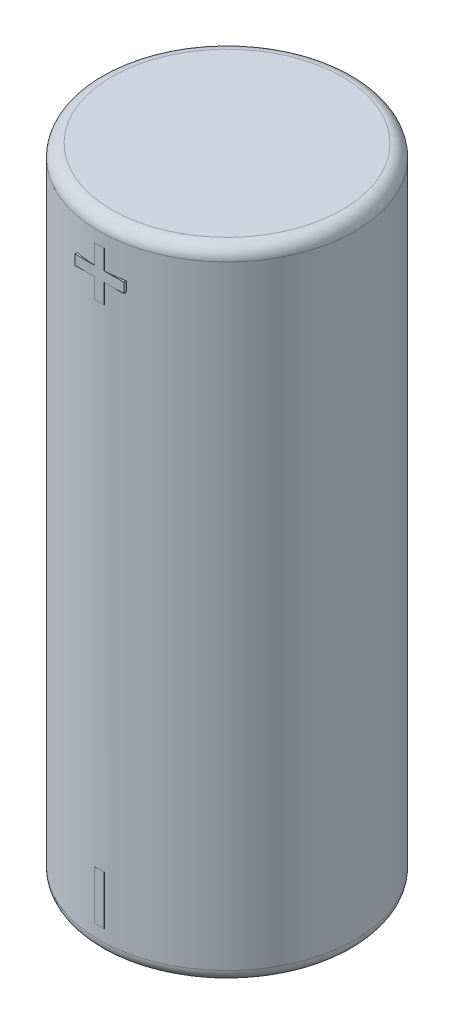
ISO-10303-21;
HEADER;
FILE_DESCRIPTION(('STEP AP214'),'2;1');
FILE_NAME('part.step','',(''),(''),'','','');
FILE_SCHEMA(('AUTOMOTIVE_DESIGN { 1 0 10303 214 1 1 1 1 }'));
ENDSEC;
DATA;
#1=APPLICATION_CONTEXT('core data for automotive mechanical design processes');
#2=APPLICATION_PROTOCOL_DEFINITION('international standard','automotive_design',2000,#1);
#3=PRODUCT_CONTEXT('',#1,'mechanical');
#4=PRODUCT('Part','Part','',(#3));
#5=PRODUCT_RELATED_PRODUCT_CATEGORY('part','',(#4));
#6=PRODUCT_DEFINITION_FORMATION('','',#4);
#7=PRODUCT_DEFINITION_CONTEXT('part definition',#1,'design');
#8=PRODUCT_DEFINITION('design','',#6,#7);
#9=PRODUCT_DEFINITION_SHAPE('','',#8);
#10=(LENGTH_UNIT() NAMED_UNIT(*) SI_UNIT(.MILLI.,.METRE.));
#11=(NAMED_UNIT(*) PLANE_ANGLE_UNIT() SI_UNIT($,.RADIAN.));
#12=(NAMED_UNIT(*) SI_UNIT($,.STERADIAN.) SOLID_ANGLE_UNIT());
#13=UNCERTAINTY_MEASURE_WITH_UNIT(LENGTH_MEASURE(1.E-05),#10,'distance_accuracy_value','');
#14=(GEOMETRIC_REPRESENTATION_CONTEXT(3) GLOBAL_UNCERTAINTY_ASSIGNED_CONTEXT((#13)) GLOBAL_UNIT_ASSIGNED_CONTEXT((#10,
#11,#12)) REPRESENTATION_CONTEXT('',''));
#15=CARTESIAN_POINT('',(0.,0.,0.));
#16=DIRECTION('',(0.,0.,1.));
#17=DIRECTION('',(1.,0.,0.));
#18=AXIS2_PLACEMENT_3D('',#15,#16,#17);
#19=CARTESIAN_POINT('',(0.,65.,0.));
#20=DIRECTION('',(0.,-1.,0.));
#21=DIRECTION('',(0.,0.,-1.));
#22=AXIS2_PLACEMENT_3D('',#19,#20,#21);
#23=CYLINDRICAL_SURFACE('',#22,13.);
#24=CARTESIAN_POINT('',(0.,7.5,0.));
#25=DIRECTION('',(0.,-1.,0.));
#26=DIRECTION('',(0.,0.,-1.));
#27=AXIS2_PLACEMENT_3D('',#24,#25,#26);
#28=CIRCLE('',#27,13.);
#29=CARTESIAN_POINT('',(0.500000000000007,7.5,12.9903810567666));
#30=VERTEX_POINT('',#29);
#31=CARTESIAN_POINT('',(0.,7.5,13.));
#32=VERTEX_POINT('',#31);
#33=EDGE_CURVE('E286',#30,#32,#28,.T.);
#34=ORIENTED_EDGE('',*,*,#33,.F.);
#35=DIRECTION('',(0.,-1.,0.));
#36=VECTOR('',#35,1.);
#37=CARTESIAN_POINT('',(0.5,65.,12.9903810567666));
#38=LINE('',#37,#36);
#39=CARTESIAN_POINT('',(0.500000000000008,2.5,12.9903810567666));
#40=VERTEX_POINT('',#39);
#41=EDGE_CURVE('E85',#40,#30,#38,.F.);
#42=ORIENTED_EDGE('',*,*,#41,.F.);
#43=CARTESIAN_POINT('',(0.,2.5,0.));
#44=DIRECTION('',(0.,-1.,0.));
#45=DIRECTION('',(0.,0.,-1.));
#46=AXIS2_PLACEMENT_3D('',#43,#44,#45);
#47=CIRCLE('',#46,13.);
#48=CARTESIAN_POINT('',(0.,2.5,13.));
#49=VERTEX_POINT('',#48);
#50=EDGE_CURVE('E290',#40,#49,#47,.T.);
#51=ORIENTED_EDGE('',*,*,#50,.T.);
#52=CARTESIAN_POINT('',(-0.500000000000002,2.5,12.9903810567666));
#53=VERTEX_POINT('',#52);
#54=EDGE_CURVE('E288',#49,#53,#47,.T.);
#55=ORIENTED_EDGE('',*,*,#54,.T.);
#56=DIRECTION('',(0.,-1.,0.));
#57=VECTOR('',#56,1.);
#58=CARTESIAN_POINT('',(-0.500000000000002,65.,12.9903810567666));
#59=LINE('',#58,#57);
#60=CARTESIAN_POINT('',(-0.499999999999993,7.5,12.9903810567666));
#61=VERTEX_POINT('',#60);
#62=EDGE_CURVE('E285',#53,#61,#59,.F.);
#63=ORIENTED_EDGE('',*,*,#62,.T.);
#64=EDGE_CURVE('E282',#32,#61,#28,.T.);
#65=ORIENTED_EDGE('',*,*,#64,.F.);
#66=EDGE_LOOP('',(#34,#42,#51,#55,#63,#65));
#67=FACE_BOUND('',#66,.T.);
#68=CARTESIAN_POINT('',(0.,1.26999999999999,0.));
#69=DIRECTION('',(0.,1.,0.));
#70=DIRECTION('',(0.,0.,1.));
#71=AXIS2_PLACEMENT_3D('',#68,#69,#70);
#72=CIRCLE('',#71,13.);
#73=CARTESIAN_POINT('',(0.,1.26999999999999,13.));
#74=VERTEX_POINT('',#73);
#75=EDGE_CURVE('E276',#74,#74,#72,.T.);
#76=ORIENTED_EDGE('',*,*,#75,.T.);
#77=EDGE_LOOP('',(#76));
#78=FACE_BOUND('',#77,.T.);
#79=CARTESIAN_POINT('',(0.,63.73,0.));
#80=DIRECTION('',(0.,1.,0.));
#81=DIRECTION('',(0.,0.,1.));
#82=AXIS2_PLACEMENT_3D('',#79,#80,#81);
#83=CIRCLE('',#82,13.);
#84=CARTESIAN_POINT('',(0.,63.73,13.));
#85=VERTEX_POINT('',#84);
#86=EDGE_CURVE('E273',#85,#85,#83,.F.);
#87=ORIENTED_EDGE('',*,*,#86,.T.);
#88=EDGE_LOOP('',(#87));
#89=FACE_BOUND('',#88,.T.);
#90=DIRECTION('',(0.,-1.,0.));
#91=VECTOR('',#90,1.);
#92=CARTESIAN_POINT('',(-0.5,65.,12.9903810567666));
#93=LINE('',#92,#91);
#94=CARTESIAN_POINT('',(-0.499999999999999,57.5,12.9903810567666));
#95=VERTEX_POINT('',#94);
#96=CARTESIAN_POINT('',(-0.499999999999999,59.5,12.9903810567666));
#97=VERTEX_POINT('',#96);
#98=EDGE_CURVE('E70',#95,#97,#93,.F.);
#99=ORIENTED_EDGE('',*,*,#98,.T.);
#100=CARTESIAN_POINT('',(0.,59.5,0.));
#101=DIRECTION('',(0.,-1.,0.));
#102=DIRECTION('',(0.,0.,-1.));
#103=AXIS2_PLACEMENT_3D('',#100,#101,#102);
#104=CIRCLE('',#103,13.);
#105=CARTESIAN_POINT('',(-2.5,59.5,12.7573508221731));
#106=VERTEX_POINT('',#105);
#107=EDGE_CURVE('E12',#97,#106,#104,.T.);
#108=ORIENTED_EDGE('',*,*,#107,.T.);
#109=DIRECTION('',(0.,-1.,0.));
#110=VECTOR('',#109,1.);
#111=CARTESIAN_POINT('',(-2.5,65.,12.7573508221731));
#112=LINE('',#111,#110);
#113=CARTESIAN_POINT('',(-2.5,60.5,12.7573508221731));
#114=VERTEX_POINT('',#113);
#115=EDGE_CURVE('E314',#106,#114,#112,.F.);
#116=ORIENTED_EDGE('',*,*,#115,.T.);
#117=CARTESIAN_POINT('',(0.,60.5,0.));
#118=DIRECTION('',(0.,-1.,0.));
#119=DIRECTION('',(0.,0.,-1.));
#120=AXIS2_PLACEMENT_3D('',#117,#118,#119);
#121=CIRCLE('',#120,13.);
#122=CARTESIAN_POINT('',(-0.499999999999999,60.5,12.9903810567666));
#123=VERTEX_POINT('',#122);
#124=EDGE_CURVE('E194',#123,#114,#121,.T.);
#125=ORIENTED_EDGE('',*,*,#124,.F.);
#126=DIRECTION('',(0.,-1.,0.));
#127=VECTOR('',#126,1.);
#128=CARTESIAN_POINT('',(-0.5,65.,12.9903810567666));
#129=LINE('',#128,#127);
#130=CARTESIAN_POINT('',(-0.5,62.5,12.9903810567666));
#131=VERTEX_POINT('',#130);
#132=EDGE_CURVE('E310',#123,#131,#129,.F.);
#133=ORIENTED_EDGE('',*,*,#132,.T.);
#134=CARTESIAN_POINT('',(0.,62.5,0.));
#135=DIRECTION('',(0.,-1.,0.));
#136=DIRECTION('',(0.,0.,-1.));
#137=AXIS2_PLACEMENT_3D('',#134,#135,#136);
#138=CIRCLE('',#137,13.);
#139=CARTESIAN_POINT('',(0.,62.5,13.));
#140=VERTEX_POINT('',#139);
#141=EDGE_CURVE('E304',#140,#131,#138,.T.);
#142=ORIENTED_EDGE('',*,*,#141,.F.);
#143=CARTESIAN_POINT('',(0.5,62.5,12.9903810567666));
#144=VERTEX_POINT('',#143);
#145=EDGE_CURVE('E301',#144,#140,#138,.T.);
#146=ORIENTED_EDGE('',*,*,#145,.F.);
#147=DIRECTION('',(0.,-1.,0.));
#148=VECTOR('',#147,1.);
#149=CARTESIAN_POINT('',(0.5,65.,12.9903810567666));
#150=LINE('',#149,#148);
#151=CARTESIAN_POINT('',(0.500000000000001,60.5,12.9903810567666));
#152=VERTEX_POINT('',#151);
#153=EDGE_CURVE('E299',#152,#144,#150,.F.);
#154=ORIENTED_EDGE('',*,*,#153,.F.);
#155=CARTESIAN_POINT('',(0.,60.5,0.));
#156=DIRECTION('',(0.,-1.,0.));
#157=DIRECTION('',(0.,0.,-1.));
#158=AXIS2_PLACEMENT_3D('',#155,#156,#157);
#159=CIRCLE('',#158,13.);
#160=CARTESIAN_POINT('',(2.5,60.5,12.7573508221731));
#161=VERTEX_POINT('',#160);
#162=EDGE_CURVE('E297',#161,#152,#159,.T.);
#163=ORIENTED_EDGE('',*,*,#162,.F.);
#164=DIRECTION('',(0.,-1.,0.));
#165=VECTOR('',#164,1.);
#166=CARTESIAN_POINT('',(2.5,65.,12.7573508221731));
#167=LINE('',#166,#165);
#168=CARTESIAN_POINT('',(2.5,59.5,12.7573508221731));
#169=VERTEX_POINT('',#168);
#170=EDGE_CURVE('E295',#169,#161,#167,.F.);
#171=ORIENTED_EDGE('',*,*,#170,.F.);
#172=CARTESIAN_POINT('',(0.,59.5,0.));
#173=DIRECTION('',(0.,-1.,0.));
#174=DIRECTION('',(0.,0.,-1.));
#175=AXIS2_PLACEMENT_3D('',#172,#173,#174);
#176=CIRCLE('',#175,13.);
#177=CARTESIAN_POINT('',(0.500000000000001,59.5,12.9903810567666));
#178=VERTEX_POINT('',#177);
#179=EDGE_CURVE('E292',#169,#178,#176,.T.);
#180=ORIENTED_EDGE('',*,*,#179,.T.);
#181=DIRECTION('',(0.,-1.,0.));
#182=VECTOR('',#181,1.);
#183=CARTESIAN_POINT('',(0.5,65.,12.9903810567666));
#184=LINE('',#183,#182);
#185=CARTESIAN_POINT('',(0.500000000000001,57.5,12.9903810567666));
#186=VERTEX_POINT('',#185);
#187=EDGE_CURVE('E303',#186,#178,#184,.F.);
#188=ORIENTED_EDGE('',*,*,#187,.F.);
#189=CARTESIAN_POINT('',(0.,57.5,0.));
#190=DIRECTION('',(0.,-1.,0.));
#191=DIRECTION('',(0.,0.,-1.));
#192=AXIS2_PLACEMENT_3D('',#189,#190,#191);
#193=CIRCLE('',#192,13.);
#194=CARTESIAN_POINT('',(0.,57.5,13.));
#195=VERTEX_POINT('',#194);
#196=EDGE_CURVE('E306',#186,#195,#193,.T.);
#197=ORIENTED_EDGE('',*,*,#196,.T.);
#198=EDGE_CURVE('E309',#195,#95,#193,.T.);
#199=ORIENTED_EDGE('',*,*,#198,.T.);
#200=EDGE_LOOP('',(#99,#108,#116,#125,#133,#142,#146,#154,#163,#171,#180,#188,#197,#199));
#201=FACE_BOUND('',#200,.T.);
#202=ADVANCED_FACE('F62',(#67,#78,#89,#201),#23,.T.);
#203=CARTESIAN_POINT('',(0.,65.,0.));
#204=DIRECTION('',(0.,1.,0.));
#205=DIRECTION('',(0.,0.,1.));
#206=AXIS2_PLACEMENT_3D('',#203,#204,#205);
#207=PLANE('',#206);
#208=CARTESIAN_POINT('',(0.,65.,0.));
#209=DIRECTION('',(0.,1.,0.));
#210=DIRECTION('',(0.,0.,1.));
#211=AXIS2_PLACEMENT_3D('',#208,#209,#210);
#212=CIRCLE('',#211,11.73);
#213=CARTESIAN_POINT('',(0.,65.,11.73));
#214=VERTEX_POINT('',#213);
#215=EDGE_CURVE('E265',#214,#214,#212,.T.);
#216=ORIENTED_EDGE('',*,*,#215,.T.);
#217=EDGE_LOOP('',(#216));
#218=FACE_BOUND('',#217,.T.);
#219=ADVANCED_FACE('F385',(#218),#207,.T.);
#220=CARTESIAN_POINT('',(0.,0.,0.));
#221=DIRECTION('',(0.,1.,0.));
#222=DIRECTION('',(0.,0.,1.));
#223=AXIS2_PLACEMENT_3D('',#220,#221,#222);
#224=PLANE('',#223);
#225=CARTESIAN_POINT('',(0.,0.,0.));
#226=DIRECTION('',(0.,1.,0.));
#227=DIRECTION('',(0.,0.,1.));
#228=AXIS2_PLACEMENT_3D('',#225,#226,#227);
#229=CIRCLE('',#228,11.73);
#230=CARTESIAN_POINT('',(0.,0.,11.73));
#231=VERTEX_POINT('',#230);
#232=EDGE_CURVE('E279',#231,#231,#229,.F.);
#233=ORIENTED_EDGE('',*,*,#232,.T.);
#234=EDGE_LOOP('',(#233));
#235=FACE_BOUND('',#234,.T.);
#236=ADVANCED_FACE('F390',(#235),#224,.F.);
#237=CARTESIAN_POINT('',(0.,63.73,0.));
#238=DIRECTION('',(0.,1.,0.));
#239=DIRECTION('',(0.,0.,1.));
#240=AXIS2_PLACEMENT_3D('',#237,#238,#239);
#241=TOROIDAL_SURFACE('',#240,11.73,1.27);
#242=ORIENTED_EDGE('',*,*,#86,.F.);
#243=EDGE_LOOP('',(#242));
#244=FACE_BOUND('',#243,.T.);
#245=ORIENTED_EDGE('',*,*,#215,.F.);
#246=EDGE_LOOP('',(#245));
#247=FACE_BOUND('',#246,.T.);
#248=ADVANCED_FACE('F395',(#244,#247),#241,.T.);
#249=CARTESIAN_POINT('',(0.,1.26999999999999,0.));
#250=DIRECTION('',(0.,1.,0.));
#251=DIRECTION('',(0.,0.,1.));
#252=AXIS2_PLACEMENT_3D('',#249,#250,#251);
#253=TOROIDAL_SURFACE('',#252,11.73,1.27);
#254=ORIENTED_EDGE('',*,*,#232,.F.);
#255=EDGE_LOOP('',(#254));
#256=FACE_BOUND('',#255,.T.);
#257=ORIENTED_EDGE('',*,*,#75,.F.);
#258=EDGE_LOOP('',(#257));
#259=FACE_BOUND('',#258,.T.);
#260=ADVANCED_FACE('F64',(#256,#259),#253,.T.);
#261=CARTESIAN_POINT('',(0.,2.5,3.));
#262=DIRECTION('',(0.,-1.,0.));
#263=DIRECTION('',(0.,0.,-1.));
#264=AXIS2_PLACEMENT_3D('',#261,#262,#263);
#265=PLANE('',#264);
#266=ORIENTED_EDGE('',*,*,#50,.F.);
#267=DIRECTION('',(0.,0.,1.));
#268=VECTOR('',#267,1.);
#269=CARTESIAN_POINT('',(0.500000000000008,2.5,3.));
#270=LINE('',#269,#268);
#271=CARTESIAN_POINT('',(0.500000000000008,2.5,13.));
#272=VERTEX_POINT('',#271);
#273=EDGE_CURVE('E262',#40,#272,#270,.T.);
#274=ORIENTED_EDGE('',*,*,#273,.T.);
#275=DIRECTION('',(1.,0.,0.));
#276=VECTOR('',#275,1.);
#277=CARTESIAN_POINT('',(0.,2.5,13.));
#278=LINE('',#277,#276);
#279=EDGE_CURVE('E216',#49,#272,#278,.T.);
#280=ORIENTED_EDGE('',*,*,#279,.F.);
#281=EDGE_LOOP('',(#266,#274,#280));
#282=FACE_BOUND('',#281,.T.);
#283=ADVANCED_FACE('F402',(#282),#265,.T.);
#284=CARTESIAN_POINT('',(-0.499999999999992,0.,3.));
#285=DIRECTION('',(-1.,0.,0.));
#286=DIRECTION('',(0.,-1.,0.));
#287=AXIS2_PLACEMENT_3D('',#284,#285,#286);
#288=PLANE('',#287);
#289=ORIENTED_EDGE('',*,*,#62,.F.);
#290=DIRECTION('',(0.,0.,1.));
#291=VECTOR('',#290,1.);
#292=CARTESIAN_POINT('',(-0.499999999999992,2.5,3.));
#293=LINE('',#292,#291);
#294=CARTESIAN_POINT('',(-0.499999999999992,2.5,13.));
#295=VERTEX_POINT('',#294);
#296=EDGE_CURVE('E263',#53,#295,#293,.T.);
#297=ORIENTED_EDGE('',*,*,#296,.T.);
#298=DIRECTION('',(0.,-1.,0.));
#299=VECTOR('',#298,1.);
#300=CARTESIAN_POINT('',(-0.499999999999992,0.,13.));
#301=LINE('',#300,#299);
#302=CARTESIAN_POINT('',(-0.499999999999993,7.5,13.));
#303=VERTEX_POINT('',#302);
#304=EDGE_CURVE('E259',#303,#295,#301,.T.);
#305=ORIENTED_EDGE('',*,*,#304,.F.);
#306=DIRECTION('',(0.,0.,1.));
#307=VECTOR('',#306,1.);
#308=CARTESIAN_POINT('',(-0.499999999999993,7.5,3.));
#309=LINE('',#308,#307);
#310=EDGE_CURVE('E266',#61,#303,#309,.T.);
#311=ORIENTED_EDGE('',*,*,#310,.F.);
#312=EDGE_LOOP('',(#289,#297,#305,#311));
#313=FACE_BOUND('',#312,.T.);
#314=ADVANCED_FACE('F453',(#313),#288,.T.);
#315=CARTESIAN_POINT('',(0.,7.5,3.));
#316=DIRECTION('',(0.,-1.,0.));
#317=DIRECTION('',(0.,0.,-1.));
#318=AXIS2_PLACEMENT_3D('',#315,#316,#317);
#319=PLANE('',#318);
#320=DIRECTION('',(0.,0.,1.));
#321=VECTOR('',#320,1.);
#322=CARTESIAN_POINT('',(0.500000000000007,7.5,3.));
#323=LINE('',#322,#321);
#324=CARTESIAN_POINT('',(0.500000000000007,7.5,13.));
#325=VERTEX_POINT('',#324);
#326=EDGE_CURVE('E268',#30,#325,#323,.T.);
#327=ORIENTED_EDGE('',*,*,#326,.F.);
#328=ORIENTED_EDGE('',*,*,#33,.T.);
#329=DIRECTION('',(1.,0.,0.));
#330=VECTOR('',#329,1.);
#331=CARTESIAN_POINT('',(0.,7.5,13.));
#332=LINE('',#331,#330);
#333=EDGE_CURVE('E255',#32,#325,#332,.T.);
#334=ORIENTED_EDGE('',*,*,#333,.T.);
#335=EDGE_LOOP('',(#327,#328,#334));
#336=FACE_BOUND('',#335,.T.);
#337=ADVANCED_FACE('F463',(#336),#319,.F.);
#338=CARTESIAN_POINT('',(0.500000000000008,0.,3.));
#339=DIRECTION('',(-1.,0.,0.));
#340=DIRECTION('',(0.,-1.,0.));
#341=AXIS2_PLACEMENT_3D('',#338,#339,#340);
#342=PLANE('',#341);
#343=ORIENTED_EDGE('',*,*,#273,.F.);
#344=ORIENTED_EDGE('',*,*,#41,.T.);
#345=ORIENTED_EDGE('',*,*,#326,.T.);
#346=DIRECTION('',(0.,-1.,0.));
#347=VECTOR('',#346,1.);
#348=CARTESIAN_POINT('',(0.500000000000008,0.,13.));
#349=LINE('',#348,#347);
#350=EDGE_CURVE('E252',#325,#272,#349,.T.);
#351=ORIENTED_EDGE('',*,*,#350,.T.);
#352=EDGE_LOOP('',(#343,#344,#345,#351));
#353=FACE_BOUND('',#352,.T.);
#354=ADVANCED_FACE('F472',(#353),#342,.F.);
#355=CARTESIAN_POINT('',(0.,0.,13.));
#356=DIRECTION('',(0.,0.,1.));
#357=DIRECTION('',(1.,0.,0.));
#358=AXIS2_PLACEMENT_3D('',#355,#356,#357);
#359=PLANE('',#358);
#360=EDGE_CURVE('E220',#295,#49,#278,.T.);
#361=ORIENTED_EDGE('',*,*,#360,.T.);
#362=ORIENTED_EDGE('',*,*,#279,.T.);
#363=ORIENTED_EDGE('',*,*,#350,.F.);
#364=ORIENTED_EDGE('',*,*,#333,.F.);
#365=EDGE_CURVE('E256',#303,#32,#332,.T.);
#366=ORIENTED_EDGE('',*,*,#365,.F.);
#367=ORIENTED_EDGE('',*,*,#304,.T.);
#368=EDGE_LOOP('',(#361,#362,#363,#364,#366,#367));
#369=FACE_BOUND('',#368,.T.);
#370=ADVANCED_FACE('F482',(#369),#359,.T.);
#371=ORIENTED_EDGE('',*,*,#54,.F.);
#372=ORIENTED_EDGE('',*,*,#360,.F.);
#373=ORIENTED_EDGE('',*,*,#296,.F.);
#374=EDGE_LOOP('',(#371,#372,#373));
#375=FACE_BOUND('',#374,.T.);
#376=ADVANCED_FACE('F456',(#375),#265,.T.);
#377=ORIENTED_EDGE('',*,*,#365,.T.);
#378=ORIENTED_EDGE('',*,*,#64,.T.);
#379=ORIENTED_EDGE('',*,*,#310,.T.);
#380=EDGE_LOOP('',(#377,#378,#379));
#381=FACE_BOUND('',#380,.T.);
#382=ADVANCED_FACE('F475',(#381),#319,.F.);
#383=CARTESIAN_POINT('',(0.,0.,13.));
#384=DIRECTION('',(0.,0.,-1.));
#385=DIRECTION('',(-1.,0.,0.));
#386=AXIS2_PLACEMENT_3D('',#383,#384,#385);
#387=PLANE('',#386);
#388=DIRECTION('',(1.,0.,0.));
#389=VECTOR('',#388,1.);
#390=CARTESIAN_POINT('',(-0.5,62.5,13.));
#391=LINE('',#390,#389);
#392=CARTESIAN_POINT('',(0.5,62.5,13.));
#393=VERTEX_POINT('',#392);
#394=EDGE_CURVE('E249',#140,#393,#391,.T.);
#395=ORIENTED_EDGE('',*,*,#394,.F.);
#396=CARTESIAN_POINT('',(-0.5,62.5,13.));
#397=VERTEX_POINT('',#396);
#398=EDGE_CURVE('E199',#397,#140,#391,.T.);
#399=ORIENTED_EDGE('',*,*,#398,.F.);
#400=DIRECTION('',(0.,-1.,0.));
#401=VECTOR('',#400,1.);
#402=CARTESIAN_POINT('',(-0.5,62.5,13.));
#403=LINE('',#402,#401);
#404=CARTESIAN_POINT('',(-0.499999999999999,60.5,13.));
#405=VERTEX_POINT('',#404);
#406=EDGE_CURVE('E209',#397,#405,#403,.T.);
#407=ORIENTED_EDGE('',*,*,#406,.T.);
#408=DIRECTION('',(1.,0.,0.));
#409=VECTOR('',#408,1.);
#410=CARTESIAN_POINT('',(-2.5,60.5,13.));
#411=LINE('',#410,#409);
#412=CARTESIAN_POINT('',(-2.5,60.5,13.));
#413=VERTEX_POINT('',#412);
#414=EDGE_CURVE('E191',#413,#405,#411,.T.);
#415=ORIENTED_EDGE('',*,*,#414,.F.);
#416=DIRECTION('',(0.,-1.,0.));
#417=VECTOR('',#416,1.);
#418=CARTESIAN_POINT('',(-2.5,60.5,13.));
#419=LINE('',#418,#417);
#420=CARTESIAN_POINT('',(-2.5,59.5,13.));
#421=VERTEX_POINT('',#420);
#422=EDGE_CURVE('E206',#413,#421,#419,.T.);
#423=ORIENTED_EDGE('',*,*,#422,.T.);
#424=DIRECTION('',(1.,0.,0.));
#425=VECTOR('',#424,1.);
#426=CARTESIAN_POINT('',(-2.5,59.5,13.));
#427=LINE('',#426,#425);
#428=CARTESIAN_POINT('',(-0.499999999999999,59.5,13.));
#429=VERTEX_POINT('',#428);
#430=EDGE_CURVE('E223',#421,#429,#427,.T.);
#431=ORIENTED_EDGE('',*,*,#430,.T.);
#432=CARTESIAN_POINT('',(-0.499999999999999,57.5,13.));
#433=VERTEX_POINT('',#432);
#434=EDGE_CURVE('E239',#429,#433,#403,.T.);
#435=ORIENTED_EDGE('',*,*,#434,.T.);
#436=DIRECTION('',(1.,0.,0.));
#437=VECTOR('',#436,1.);
#438=CARTESIAN_POINT('',(-0.499999999999999,57.5,13.));
#439=LINE('',#438,#437);
#440=EDGE_CURVE('E240',#433,#195,#439,.T.);
#441=ORIENTED_EDGE('',*,*,#440,.T.);
#442=CARTESIAN_POINT('',(0.500000000000001,57.5,13.));
#443=VERTEX_POINT('',#442);
#444=EDGE_CURVE('E244',#195,#443,#439,.T.);
#445=ORIENTED_EDGE('',*,*,#444,.T.);
#446=DIRECTION('',(0.,-1.,0.));
#447=VECTOR('',#446,1.);
#448=CARTESIAN_POINT('',(0.5,62.5,13.));
#449=LINE('',#448,#447);
#450=CARTESIAN_POINT('',(0.500000000000001,59.5,13.));
#451=VERTEX_POINT('',#450);
#452=EDGE_CURVE('E247',#451,#443,#449,.T.);
#453=ORIENTED_EDGE('',*,*,#452,.F.);
#454=CARTESIAN_POINT('',(2.5,59.5,13.));
#455=VERTEX_POINT('',#454);
#456=EDGE_CURVE('E217',#451,#455,#427,.T.);
#457=ORIENTED_EDGE('',*,*,#456,.T.);
#458=DIRECTION('',(0.,-1.,0.));
#459=VECTOR('',#458,1.);
#460=CARTESIAN_POINT('',(2.5,60.5,13.));
#461=LINE('',#460,#459);
#462=CARTESIAN_POINT('',(2.5,60.5,13.));
#463=VERTEX_POINT('',#462);
#464=EDGE_CURVE('E349',#463,#455,#461,.T.);
#465=ORIENTED_EDGE('',*,*,#464,.F.);
#466=CARTESIAN_POINT('',(0.500000000000001,60.5,13.));
#467=VERTEX_POINT('',#466);
#468=EDGE_CURVE('E210',#467,#463,#411,.T.);
#469=ORIENTED_EDGE('',*,*,#468,.F.);
#470=EDGE_CURVE('E243',#393,#467,#449,.T.);
#471=ORIENTED_EDGE('',*,*,#470,.F.);
#472=EDGE_LOOP('',(#395,#399,#407,#415,#423,#431,#435,#441,#445,#453,#457,#465,#469,#471));
#473=FACE_BOUND('',#472,.T.);
#474=ADVANCED_FACE('F204',(#473),#387,.F.);
#475=CARTESIAN_POINT('',(-0.499999999999999,57.5,3.));
#476=DIRECTION('',(0.,-1.,0.));
#477=DIRECTION('',(0.,0.,-1.));
#478=AXIS2_PLACEMENT_3D('',#475,#476,#477);
#479=PLANE('',#478);
#480=ORIENTED_EDGE('',*,*,#196,.F.);
#481=DIRECTION('',(0.,0.,1.));
#482=VECTOR('',#481,1.);
#483=CARTESIAN_POINT('',(0.500000000000001,57.5,3.));
#484=LINE('',#483,#482);
#485=EDGE_CURVE('E230',#186,#443,#484,.T.);
#486=ORIENTED_EDGE('',*,*,#485,.T.);
#487=ORIENTED_EDGE('',*,*,#444,.F.);
#488=EDGE_LOOP('',(#480,#486,#487));
#489=FACE_BOUND('',#488,.T.);
#490=ADVANCED_FACE('F332',(#489),#479,.T.);
#491=CARTESIAN_POINT('',(-0.5,62.5,3.));
#492=DIRECTION('',(-1.,0.,0.));
#493=DIRECTION('',(0.,-1.,0.));
#494=AXIS2_PLACEMENT_3D('',#491,#492,#493);
#495=PLANE('',#494);
#496=ORIENTED_EDGE('',*,*,#98,.F.);
#497=DIRECTION('',(0.,0.,1.));
#498=VECTOR('',#497,1.);
#499=CARTESIAN_POINT('',(-0.499999999999999,57.5,3.));
#500=LINE('',#499,#498);
#501=EDGE_CURVE('E234',#95,#433,#500,.T.);
#502=ORIENTED_EDGE('',*,*,#501,.T.);
#503=ORIENTED_EDGE('',*,*,#434,.F.);
#504=DIRECTION('',(0.,0.,1.));
#505=VECTOR('',#504,1.);
#506=CARTESIAN_POINT('',(-0.499999999999999,59.5,3.));
#507=LINE('',#506,#505);
#508=EDGE_CURVE('E231',#97,#429,#507,.T.);
#509=ORIENTED_EDGE('',*,*,#508,.F.);
#510=EDGE_LOOP('',(#496,#502,#503,#509));
#511=FACE_BOUND('',#510,.T.);
#512=ADVANCED_FACE('F321',(#511),#495,.T.);
#513=CARTESIAN_POINT('',(0.5,62.5,3.));
#514=DIRECTION('',(-1.,0.,0.));
#515=DIRECTION('',(0.,-1.,0.));
#516=AXIS2_PLACEMENT_3D('',#513,#514,#515);
#517=PLANE('',#516);
#518=ORIENTED_EDGE('',*,*,#485,.F.);
#519=ORIENTED_EDGE('',*,*,#187,.T.);
#520=DIRECTION('',(0.,0.,1.));
#521=VECTOR('',#520,1.);
#522=CARTESIAN_POINT('',(0.500000000000001,59.5,3.));
#523=LINE('',#522,#521);
#524=EDGE_CURVE('E77',#178,#451,#523,.T.);
#525=ORIENTED_EDGE('',*,*,#524,.T.);
#526=ORIENTED_EDGE('',*,*,#452,.T.);
#527=EDGE_LOOP('',(#518,#519,#525,#526));
#528=FACE_BOUND('',#527,.T.);
#529=ADVANCED_FACE('F335',(#528),#517,.F.);
#530=ORIENTED_EDGE('',*,*,#132,.F.);
#531=DIRECTION('',(0.,0.,1.));
#532=VECTOR('',#531,1.);
#533=CARTESIAN_POINT('',(-0.499999999999999,60.5,3.));
#534=LINE('',#533,#532);
#535=EDGE_CURVE('E358',#123,#405,#534,.T.);
#536=ORIENTED_EDGE('',*,*,#535,.T.);
#537=ORIENTED_EDGE('',*,*,#406,.F.);
#538=DIRECTION('',(0.,0.,1.));
#539=VECTOR('',#538,1.);
#540=CARTESIAN_POINT('',(-0.5,62.5,3.));
#541=LINE('',#540,#539);
#542=EDGE_CURVE('E236',#131,#397,#541,.T.);
#543=ORIENTED_EDGE('',*,*,#542,.F.);
#544=EDGE_LOOP('',(#530,#536,#537,#543));
#545=FACE_BOUND('',#544,.T.);
#546=ADVANCED_FACE('F370',(#545),#495,.T.);
#547=CARTESIAN_POINT('',(-0.5,62.5,3.));
#548=DIRECTION('',(0.,-1.,0.));
#549=DIRECTION('',(0.,0.,-1.));
#550=AXIS2_PLACEMENT_3D('',#547,#548,#549);
#551=PLANE('',#550);
#552=DIRECTION('',(0.,0.,1.));
#553=VECTOR('',#552,1.);
#554=CARTESIAN_POINT('',(0.5,62.5,3.));
#555=LINE('',#554,#553);
#556=EDGE_CURVE('E227',#144,#393,#555,.T.);
#557=ORIENTED_EDGE('',*,*,#556,.F.);
#558=ORIENTED_EDGE('',*,*,#145,.T.);
#559=ORIENTED_EDGE('',*,*,#394,.T.);
#560=EDGE_LOOP('',(#557,#558,#559));
#561=FACE_BOUND('',#560,.T.);
#562=ADVANCED_FACE('F338',(#561),#551,.F.);
#563=DIRECTION('',(0.,0.,1.));
#564=VECTOR('',#563,1.);
#565=CARTESIAN_POINT('',(0.500000000000001,60.5,3.));
#566=LINE('',#565,#564);
#567=EDGE_CURVE('E360',#152,#467,#566,.T.);
#568=ORIENTED_EDGE('',*,*,#567,.F.);
#569=ORIENTED_EDGE('',*,*,#153,.T.);
#570=ORIENTED_EDGE('',*,*,#556,.T.);
#571=ORIENTED_EDGE('',*,*,#470,.T.);
#572=EDGE_LOOP('',(#568,#569,#570,#571));
#573=FACE_BOUND('',#572,.T.);
#574=ADVANCED_FACE('F343',(#573),#517,.F.);
#575=CARTESIAN_POINT('',(-2.5,60.5,3.));
#576=DIRECTION('',(-1.,0.,0.));
#577=DIRECTION('',(0.,0.,1.));
#578=AXIS2_PLACEMENT_3D('',#575,#576,#577);
#579=PLANE('',#578);
#580=ORIENTED_EDGE('',*,*,#115,.F.);
#581=DIRECTION('',(0.,0.,1.));
#582=VECTOR('',#581,1.);
#583=CARTESIAN_POINT('',(-2.5,59.5,3.));
#584=LINE('',#583,#582);
#585=EDGE_CURVE('E211',#106,#421,#584,.T.);
#586=ORIENTED_EDGE('',*,*,#585,.T.);
#587=ORIENTED_EDGE('',*,*,#422,.F.);
#588=DIRECTION('',(0.,0.,1.));
#589=VECTOR('',#588,1.);
#590=CARTESIAN_POINT('',(-2.5,60.5,3.));
#591=LINE('',#590,#589);
#592=EDGE_CURVE('E187',#114,#413,#591,.T.);
#593=ORIENTED_EDGE('',*,*,#592,.F.);
#594=EDGE_LOOP('',(#580,#586,#587,#593));
#595=FACE_BOUND('',#594,.T.);
#596=ADVANCED_FACE('F213',(#595),#579,.T.);
#597=CARTESIAN_POINT('',(2.5,60.5,3.));
#598=DIRECTION('',(-1.,0.,0.));
#599=DIRECTION('',(0.,0.,1.));
#600=AXIS2_PLACEMENT_3D('',#597,#598,#599);
#601=PLANE('',#600);
#602=DIRECTION('',(0.,0.,1.));
#603=VECTOR('',#602,1.);
#604=CARTESIAN_POINT('',(2.5,59.5,3.));
#605=LINE('',#604,#603);
#606=EDGE_CURVE('E354',#169,#455,#605,.T.);
#607=ORIENTED_EDGE('',*,*,#606,.F.);
#608=ORIENTED_EDGE('',*,*,#170,.T.);
#609=DIRECTION('',(0.,0.,1.));
#610=VECTOR('',#609,1.);
#611=CARTESIAN_POINT('',(2.5,60.5,3.));
#612=LINE('',#611,#610);
#613=EDGE_CURVE('E198',#161,#463,#612,.T.);
#614=ORIENTED_EDGE('',*,*,#613,.T.);
#615=ORIENTED_EDGE('',*,*,#464,.T.);
#616=EDGE_LOOP('',(#607,#608,#614,#615));
#617=FACE_BOUND('',#616,.T.);
#618=ADVANCED_FACE('F568',(#617),#601,.F.);
#619=ORIENTED_EDGE('',*,*,#198,.F.);
#620=ORIENTED_EDGE('',*,*,#440,.F.);
#621=ORIENTED_EDGE('',*,*,#501,.F.);
#622=EDGE_LOOP('',(#619,#620,#621));
#623=FACE_BOUND('',#622,.T.);
#624=ADVANCED_FACE('F326',(#623),#479,.T.);
#625=ORIENTED_EDGE('',*,*,#398,.T.);
#626=ORIENTED_EDGE('',*,*,#141,.T.);
#627=ORIENTED_EDGE('',*,*,#542,.T.);
#628=EDGE_LOOP('',(#625,#626,#627));
#629=FACE_BOUND('',#628,.T.);
#630=ADVANCED_FACE('F368',(#629),#551,.F.);
#631=CARTESIAN_POINT('',(-2.5,60.5,3.));
#632=DIRECTION('',(0.,-1.,0.));
#633=DIRECTION('',(0.,0.,-1.));
#634=AXIS2_PLACEMENT_3D('',#631,#632,#633);
#635=PLANE('',#634);
#636=ORIENTED_EDGE('',*,*,#535,.F.);
#637=ORIENTED_EDGE('',*,*,#124,.T.);
#638=ORIENTED_EDGE('',*,*,#592,.T.);
#639=ORIENTED_EDGE('',*,*,#414,.T.);
#640=EDGE_LOOP('',(#636,#637,#638,#639));
#641=FACE_BOUND('',#640,.T.);
#642=ADVANCED_FACE('F190',(#641),#635,.F.);
#643=CARTESIAN_POINT('',(-2.5,59.5,3.));
#644=DIRECTION('',(0.,-1.,0.));
#645=DIRECTION('',(0.,0.,-1.));
#646=AXIS2_PLACEMENT_3D('',#643,#644,#645);
#647=PLANE('',#646);
#648=ORIENTED_EDGE('',*,*,#107,.F.);
#649=ORIENTED_EDGE('',*,*,#508,.T.);
#650=ORIENTED_EDGE('',*,*,#430,.F.);
#651=ORIENTED_EDGE('',*,*,#585,.F.);
#652=EDGE_LOOP('',(#648,#649,#650,#651));
#653=FACE_BOUND('',#652,.T.);
#654=ADVANCED_FACE('F372',(#653),#647,.T.);
#655=ORIENTED_EDGE('',*,*,#613,.F.);
#656=ORIENTED_EDGE('',*,*,#162,.T.);
#657=ORIENTED_EDGE('',*,*,#567,.T.);
#658=ORIENTED_EDGE('',*,*,#468,.T.);
#659=EDGE_LOOP('',(#655,#656,#657,#658));
#660=FACE_BOUND('',#659,.T.);
#661=ADVANCED_FACE('F362',(#660),#635,.F.);
#662=ORIENTED_EDGE('',*,*,#179,.F.);
#663=ORIENTED_EDGE('',*,*,#606,.T.);
#664=ORIENTED_EDGE('',*,*,#456,.F.);
#665=ORIENTED_EDGE('',*,*,#524,.F.);
#666=EDGE_LOOP('',(#662,#663,#664,#665));
#667=FACE_BOUND('',#666,.T.);
#668=ADVANCED_FACE('F375',(#667),#647,.T.);
#669=CLOSED_SHELL('',(#202,#219,#236,#248,#260,#283,#314,#337,#354,#370,#376,#382,#474,#490,
#512,#529,#546,#562,#574,#596,#618,#624,#630,#642,#654,#661,#668));
#670=MANIFOLD_SOLID_BREP('B2',#669);
#671=ADVANCED_BREP_SHAPE_REPRESENTATION('',(#18,#670),#14);
#672=SHAPE_DEFINITION_REPRESENTATION(#9,#671);
ENDSEC;
END-ISO-10303-21;
